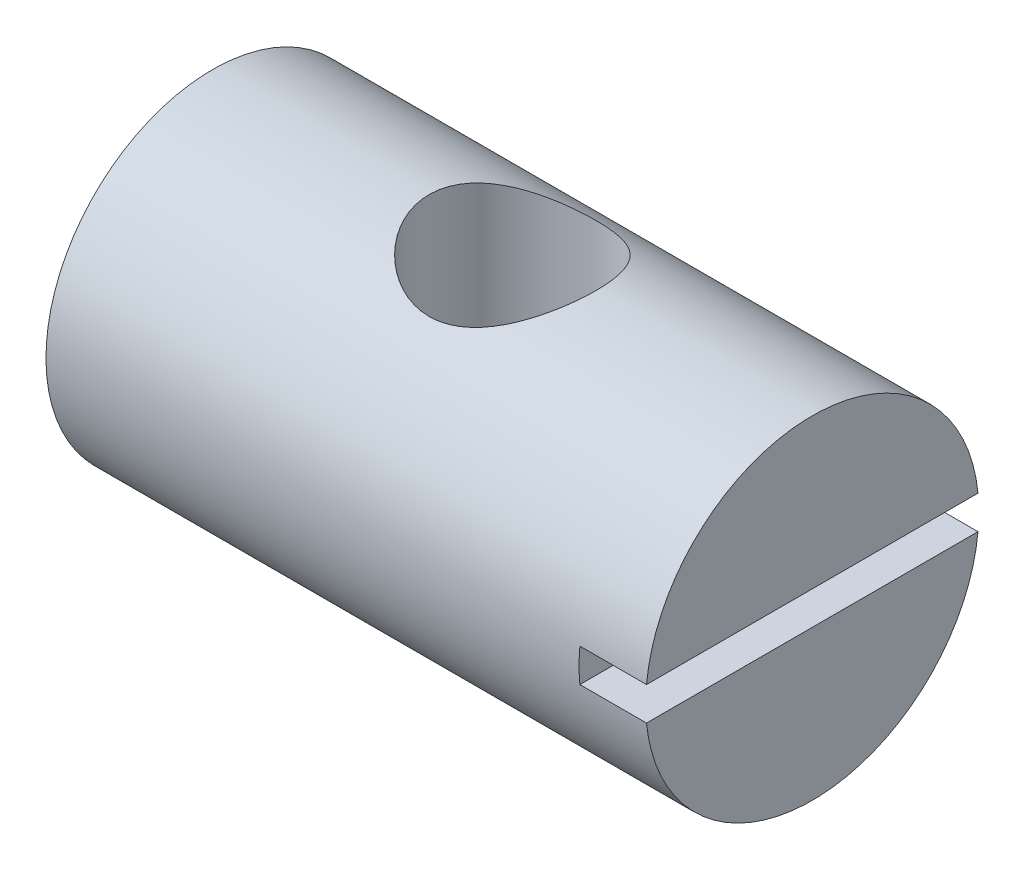
ISO-10303-21;
HEADER;
FILE_DESCRIPTION(('STEP AP214'),'2;1');
FILE_NAME('part.step','',(''),(''),'','','');
FILE_SCHEMA(('AUTOMOTIVE_DESIGN { 1 0 10303 214 1 1 1 1 }'));
ENDSEC;
DATA;
#1=APPLICATION_CONTEXT('core data for automotive mechanical design processes');
#2=APPLICATION_PROTOCOL_DEFINITION('international standard','automotive_design',2000,#1);
#3=PRODUCT_CONTEXT('',#1,'mechanical');
#4=PRODUCT('Part','Part','',(#3));
#5=PRODUCT_RELATED_PRODUCT_CATEGORY('part','',(#4));
#6=PRODUCT_DEFINITION_FORMATION('','',#4);
#7=PRODUCT_DEFINITION_CONTEXT('part definition',#1,'design');
#8=PRODUCT_DEFINITION('design','',#6,#7);
#9=PRODUCT_DEFINITION_SHAPE('','',#8);
#10=(LENGTH_UNIT() NAMED_UNIT(*) SI_UNIT(.MILLI.,.METRE.));
#11=(NAMED_UNIT(*) PLANE_ANGLE_UNIT() SI_UNIT($,.RADIAN.));
#12=(NAMED_UNIT(*) SI_UNIT($,.STERADIAN.) SOLID_ANGLE_UNIT());
#13=UNCERTAINTY_MEASURE_WITH_UNIT(LENGTH_MEASURE(1.E-05),#10,'distance_accuracy_value','');
#14=(GEOMETRIC_REPRESENTATION_CONTEXT(3) GLOBAL_UNCERTAINTY_ASSIGNED_CONTEXT((#13)) GLOBAL_UNIT_ASSIGNED_CONTEXT((#10,
#11,#12)) REPRESENTATION_CONTEXT('',''));
#15=CARTESIAN_POINT('',(0.,0.,0.));
#16=DIRECTION('',(0.,0.,1.));
#17=DIRECTION('',(1.,0.,0.));
#18=AXIS2_PLACEMENT_3D('',#15,#16,#17);
#19=CARTESIAN_POINT('',(9.,0.,0.));
#20=DIRECTION('',(1.,0.,0.));
#21=DIRECTION('',(0.,0.,-1.));
#22=AXIS2_PLACEMENT_3D('',#19,#20,#21);
#23=PLANE('',#22);
#24=DIRECTION('',(0.,0.,-1.));
#25=VECTOR('',#24,1.);
#26=CARTESIAN_POINT('',(9.,-0.5,0.));
#27=LINE('',#26,#25);
#28=CARTESIAN_POINT('',(9.,-0.5,4.9749371855331));
#29=VERTEX_POINT('',#28);
#30=CARTESIAN_POINT('',(9.,-0.5,-4.9749371855331));
#31=VERTEX_POINT('',#30);
#32=EDGE_CURVE('E81',#29,#31,#27,.T.);
#33=ORIENTED_EDGE('',*,*,#32,.F.);
#34=CARTESIAN_POINT('',(9.,0.,0.));
#35=DIRECTION('',(1.,0.,0.));
#36=DIRECTION('',(0.,0.,-1.));
#37=AXIS2_PLACEMENT_3D('',#34,#35,#36);
#38=CIRCLE('',#37,5.);
#39=EDGE_CURVE('E94',#29,#31,#38,.T.);
#40=ORIENTED_EDGE('',*,*,#39,.T.);
#41=EDGE_LOOP('',(#33,#40));
#42=FACE_BOUND('',#41,.T.);
#43=ADVANCED_FACE('F33',(#42),#23,.T.);
#44=CARTESIAN_POINT('',(9.,0.,0.));
#45=DIRECTION('',(-1.,0.,0.));
#46=DIRECTION('',(0.,0.,1.));
#47=AXIS2_PLACEMENT_3D('',#44,#45,#46);
#48=CYLINDRICAL_SURFACE('',#47,5.);
#49=ORIENTED_EDGE('',*,*,#39,.F.);
#50=DIRECTION('',(-1.,0.,0.));
#51=VECTOR('',#50,1.);
#52=CARTESIAN_POINT('',(9.,-0.5,4.9749371855331));
#53=LINE('',#52,#51);
#54=CARTESIAN_POINT('',(7.,-0.5,4.9749371855331));
#55=VERTEX_POINT('',#54);
#56=EDGE_CURVE('E129',#29,#55,#53,.T.);
#57=ORIENTED_EDGE('',*,*,#56,.T.);
#58=CARTESIAN_POINT('',(7.,0.,0.));
#59=DIRECTION('',(1.,0.,0.));
#60=DIRECTION('',(0.,0.,-1.));
#61=AXIS2_PLACEMENT_3D('',#58,#59,#60);
#62=CIRCLE('',#61,5.);
#63=CARTESIAN_POINT('',(7.,0.5,4.9749371855331));
#64=VERTEX_POINT('',#63);
#65=EDGE_CURVE('E11',#64,#55,#62,.T.);
#66=ORIENTED_EDGE('',*,*,#65,.F.);
#67=DIRECTION('',(-1.,0.,0.));
#68=VECTOR('',#67,1.);
#69=CARTESIAN_POINT('',(9.,0.5,4.9749371855331));
#70=LINE('',#69,#68);
#71=CARTESIAN_POINT('',(9.,0.5,4.9749371855331));
#72=VERTEX_POINT('',#71);
#73=EDGE_CURVE('E76',#64,#72,#70,.F.);
#74=ORIENTED_EDGE('',*,*,#73,.T.);
#75=CARTESIAN_POINT('',(9.,0.5,-4.9749371855331));
#76=VERTEX_POINT('',#75);
#77=EDGE_CURVE('E88',#76,#72,#38,.T.);
#78=ORIENTED_EDGE('',*,*,#77,.F.);
#79=DIRECTION('',(-1.,0.,0.));
#80=VECTOR('',#79,1.);
#81=CARTESIAN_POINT('',(9.,0.5,-4.9749371855331));
#82=LINE('',#81,#80);
#83=CARTESIAN_POINT('',(7.,0.5,-4.9749371855331));
#84=VERTEX_POINT('',#83);
#85=EDGE_CURVE('E49',#76,#84,#82,.T.);
#86=ORIENTED_EDGE('',*,*,#85,.T.);
#87=CARTESIAN_POINT('',(7.,-0.5,-4.9749371855331));
#88=VERTEX_POINT('',#87);
#89=EDGE_CURVE('E38',#88,#84,#62,.T.);
#90=ORIENTED_EDGE('',*,*,#89,.F.);
#91=DIRECTION('',(-1.,0.,0.));
#92=VECTOR('',#91,1.);
#93=CARTESIAN_POINT('',(9.,-0.5,-4.9749371855331));
#94=LINE('',#93,#92);
#95=EDGE_CURVE('E57',#88,#31,#94,.F.);
#96=ORIENTED_EDGE('',*,*,#95,.T.);
#97=EDGE_LOOP('',(#49,#57,#66,#74,#78,#86,#90,#96));
#98=FACE_BOUND('',#97,.T.);
#99=CARTESIAN_POINT('',(-2.5,-5.,0.));
#100=CARTESIAN_POINT('',(-2.49999033094399,-4.99999177550472,0.131426682334305));
#101=CARTESIAN_POINT('',(-2.48957443822597,-4.99476199135277,0.263015634437213));
#102=CARTESIAN_POINT('',(-2.44836817883795,-4.9743541856102,0.522301454622883));
#103=CARTESIAN_POINT('',(-2.41753911907498,-4.9591572718767,0.649990448564105));
#104=CARTESIAN_POINT('',(-2.33701537728116,-4.92040690922477,0.897333631316203));
#105=CARTESIAN_POINT('',(-2.28739401221727,-4.89688595907259,1.01701694536277));
#106=CARTESIAN_POINT('',(-2.1710734737482,-4.84364443325827,1.24618160399671));
#107=CARTESIAN_POINT('',(-2.10437564685491,-4.81392434644421,1.3556637520377));
#108=CARTESIAN_POINT('',(-1.95120686835737,-4.74890645050632,1.56876952630998));
#109=CARTESIAN_POINT('',(-1.86378379977022,-4.71337997659091,1.67163802294308));
#110=CARTESIAN_POINT('',(-1.67369630401471,-4.64149925776731,1.86194861703333));
#111=CARTESIAN_POINT('',(-1.57102037115989,-4.60514440566897,1.94937895911555));
#112=CARTESIAN_POINT('',(-1.34379162555472,-4.53247377945622,2.11312999967247));
#113=CARTESIAN_POINT('',(-1.21815975396499,-4.49637967412567,2.18806333849064));
#114=CARTESIAN_POINT('',(-0.954081660204565,-4.43214946943555,2.31542056761491));
#115=CARTESIAN_POINT('',(-0.815644678237381,-4.40400769020792,2.36786053751682));
#116=CARTESIAN_POINT('',(-0.538337236403587,-4.36144667591402,2.44533110537653));
#117=CARTESIAN_POINT('',(-0.399988869820418,-4.34630678958452,2.47181464267578));
#118=CARTESIAN_POINT('',(-0.120052905562392,-4.3295472487215,2.50106748329741));
#119=CARTESIAN_POINT('',(0.0215313521750937,-4.3279142335843,2.50386022093906));
#120=CARTESIAN_POINT('',(0.285715060790882,-4.33777325642937,2.48671821792512));
#121=CARTESIAN_POINT('',(0.408560078058287,-4.34771909154984,2.46946139884055));
#122=CARTESIAN_POINT('',(0.649304773431946,-4.37690571834675,2.41734962264384));
#123=CARTESIAN_POINT('',(0.767202863263112,-4.39614947079454,2.38248905974454));
#124=CARTESIAN_POINT('',(0.998072831414332,-4.44218691031839,2.29552445096459));
#125=CARTESIAN_POINT('',(1.11086599696452,-4.46914601659993,2.24303766778987));
#126=CARTESIAN_POINT('',(1.32658573147497,-4.52758510703513,2.12260421917012));
#127=CARTESIAN_POINT('',(1.42950783900021,-4.55906711950478,2.0546506095312));
#128=CARTESIAN_POINT('',(1.63630313185808,-4.62782894758213,1.89516513728194));
#129=CARTESIAN_POINT('',(1.7386421839404,-4.66533775591865,1.8017361459232));
#130=CARTESIAN_POINT('',(1.92683854647725,-4.73869058251019,1.59888894685344));
#131=CARTESIAN_POINT('',(2.01268798008471,-4.77453379897003,1.48946314143571));
#132=CARTESIAN_POINT('',(2.16921415257432,-4.84254968207409,1.25129126457962));
#133=CARTESIAN_POINT('',(2.23900118111436,-4.87447460405015,1.12188397899853));
#134=CARTESIAN_POINT('',(2.35524257260752,-4.92894702803109,0.851165538721985));
#135=CARTESIAN_POINT('',(2.4017154625379,-4.95150197358893,0.709863940663162));
#136=CARTESIAN_POINT('',(2.4661885092917,-4.98310834353579,0.43191622915178));
#137=CARTESIAN_POINT('',(2.486228089367,-4.9931234575324,0.295853826370905));
#138=CARTESIAN_POINT('',(2.50366182783617,-5.00182533647794,0.021948999873288));
#139=CARTESIAN_POINT('',(2.5010667140985,-5.00051746803426,-0.115892549675109));
#140=CARTESIAN_POINT('',(2.4744832789533,-4.98727980633468,-0.378082429964657));
#141=CARTESIAN_POINT('',(2.45216866817559,-4.97618114219992,-0.502648520123707));
#142=CARTESIAN_POINT('',(2.38940482026162,-4.94555428287529,-0.746017230755972));
#143=CARTESIAN_POINT('',(2.34895358386411,-4.92602515837625,-0.864819214231883));
#144=CARTESIAN_POINT('',(2.25000383391964,-4.87960628532329,-1.09722152111965));
#145=CARTESIAN_POINT('',(2.19102237471768,-4.85252204417873,-1.21057599249831));
#146=CARTESIAN_POINT('',(2.05723116087518,-4.7935993579975,-1.42615340426439));
#147=CARTESIAN_POINT('',(1.98241466348012,-4.76175888940534,-1.52837157450203));
#148=CARTESIAN_POINT('',(1.81059893670911,-4.69270553315087,-1.72941922315487));
#149=CARTESIAN_POINT('',(1.7121428290248,-4.65527212009488,-1.82693019428496));
#150=CARTESIAN_POINT('',(1.50018712195056,-4.58155978921587,-2.0046408025722));
#151=CARTESIAN_POINT('',(1.38667720293013,-4.54528168472407,-2.08482846428685));
#152=CARTESIAN_POINT('',(1.14089086451535,-4.4762798054528,-2.22926978618995));
#153=CARTESIAN_POINT('',(1.00797183470886,-4.44381323981254,-2.29256373922243));
#154=CARTESIAN_POINT('',(0.731224831117449,-4.38935180726746,-2.39520706511459));
#155=CARTESIAN_POINT('',(0.58741118400001,-4.36734345549014,-2.43458729077055));
#156=CARTESIAN_POINT('',(0.307724442637058,-4.33903752569351,-2.48465421767005));
#157=CARTESIAN_POINT('',(0.172414365881031,-4.33143458674096,-2.4977324874436));
#158=CARTESIAN_POINT('',(-0.0986176673806788,-4.32913386592579,-2.50172288950898));
#159=CARTESIAN_POINT('',(-0.234339419873629,-4.33443049025111,-2.49264462983266));
#160=CARTESIAN_POINT('',(-0.48870875561685,-4.35594655164663,-2.45481530197332));
#161=CARTESIAN_POINT('',(-0.607751181720765,-4.37107736338133,-2.42802074302696));
#162=CARTESIAN_POINT('',(-0.839520292199954,-4.40927540337602,-2.35793843840544));
#163=CARTESIAN_POINT('',(-0.952244931566541,-4.43234518434965,-2.31464538728732));
#164=CARTESIAN_POINT('',(-1.17656215271973,-4.48571326433413,-2.20953919315538));
#165=CARTESIAN_POINT('',(-1.28756985173502,-4.5163930799845,-2.14667719009403));
#166=CARTESIAN_POINT('',(-1.49818624324005,-4.58088327077455,-2.0053780838799));
#167=CARTESIAN_POINT('',(-1.59778896262873,-4.61469526970767,-1.92693287765888));
#168=CARTESIAN_POINT('',(-1.79535536374964,-4.68655816327011,-1.74550556946065));
#169=CARTESIAN_POINT('',(-1.89164936417138,-4.7246249151498,-1.6407002246921));
#170=CARTESIAN_POINT('',(-2.06565584942804,-4.79694347383545,-1.41539785420684));
#171=CARTESIAN_POINT('',(-2.14335831860588,-4.83119321905446,-1.29489242426332));
#172=CARTESIAN_POINT('',(-2.2780969794841,-4.89245149457782,-1.03978808878536));
#173=CARTESIAN_POINT('',(-2.33498316778445,-4.91940711437488,-0.905095560782288));
#174=CARTESIAN_POINT('',(-2.4021838587924,-4.95177960923351,-0.696328709257351));
#175=CARTESIAN_POINT('',(-2.42155539800181,-4.96122314081874,-0.625670413494088));
#176=CARTESIAN_POINT('',(-2.4540659483706,-4.97717127275101,-0.482623997839257));
#177=CARTESIAN_POINT('',(-2.46720876667635,-4.98367766823159,-0.410236963092401));
#178=CARTESIAN_POINT('',(-2.48473747228463,-4.9923820076613,-0.281518684621671));
#179=CARTESIAN_POINT('',(-2.49045493653132,-4.99523288466454,-0.225408499555444));
#180=CARTESIAN_POINT('',(-2.49808832946571,-4.99904367329659,-0.112875528456288));
#181=CARTESIAN_POINT('',(-2.50000415322548,-5.00000353273198,-0.0564527338382176));
#182=CARTESIAN_POINT('',(-2.5,-5.,0.));
#183=B_SPLINE_CURVE_WITH_KNOTS('',3,(#99,#100,#101,#102,#103,#104,#105,#106,#107,#108,#109,#110,
#111,#112,#113,#114,#115,#116,#117,#118,#119,#120,#121,#122,#123,#124,#125,#126,#127,#128,#129,
#130,#131,#132,#133,#134,#135,#136,#137,#138,#139,#140,#141,#142,#143,#144,#145,#146,#147,#148,
#149,#150,#151,#152,#153,#154,#155,#156,#157,#158,#159,#160,#161,#162,#163,#164,#165,#166,#167,
#168,#169,#170,#171,#172,#173,#174,#175,#176,#177,#178,#179,#180,#181,#182),.UNSPECIFIED.,.T.,
.F.,(4,2,2,2,2,2,2,2,2,2,2,2,2,2,2,2,2,2,2,2,2,2,2,2,2,2,2,2,2,2,2,2,2,2,2,2,2,2,2,2,2,4),(0.,
0.394060643550731,0.788870374272994,1.18215538873075,1.57540940145392,1.99245439679522,
2.40981559413509,2.85954316076882,3.30894869745702,3.73145030350574,4.15353393322551,
4.52514281023301,4.89687009814196,5.27725600421218,5.65781303150554,6.08662353334696,
6.51563836496716,6.96457555536101,7.41315542280699,7.82458226178364,8.2358141127869,
8.61517266265305,8.99457304077329,9.38482140069746,9.77523626870848,10.2039902661037,
10.6330397153795,11.0828670540368,11.53211279863,11.9382326875699,12.3441764966107,
12.7114482562151,13.0788382197025,13.4709114195009,13.8631890285845,14.303131068923,
14.7433095845248,15.1866003415819,15.407934939208,15.6291340766843,15.7983933645035,
15.9676573239323),.UNSPECIFIED.);
#184=CARTESIAN_POINT('',(-2.5,-5.,0.));
#185=VERTEX_POINT('',#184);
#186=EDGE_CURVE('E82',#185,#185,#183,.T.);
#187=ORIENTED_EDGE('',*,*,#186,.T.);
#188=EDGE_LOOP('',(#187));
#189=FACE_BOUND('',#188,.T.);
#190=CARTESIAN_POINT('',(0.,4.33012701892219,2.5));
#191=CARTESIAN_POINT('',(-0.130266506876492,4.33013982272992,2.49998948436432));
#192=CARTESIAN_POINT('',(-0.260702720676248,4.33609541965583,2.48974954513168));
#193=CARTESIAN_POINT('',(-0.517568971529232,4.35905877051907,2.44930840724943));
#194=CARTESIAN_POINT('',(-0.64399000405729,4.37608974726023,2.41906526369545));
#195=CARTESIAN_POINT('',(-0.888628945561065,4.41873376871659,2.3402497699757));
#196=CARTESIAN_POINT('',(-1.00688657356221,4.44430111338921,2.29177485369963));
#197=CARTESIAN_POINT('',(-1.23356056309455,4.50106659111456,2.17816884056414));
#198=CARTESIAN_POINT('',(-1.34197639179579,4.53226502875883,2.11303684262671));
#199=CARTESIAN_POINT('',(-1.55576430391692,4.59992173524851,1.96166634317253));
#200=CARTESIAN_POINT('',(-1.66014783448977,4.63660159331577,1.87413008816917));
#201=CARTESIAN_POINT('',(-1.8535209757132,4.70929956727453,1.68313452122752));
#202=CARTESIAN_POINT('',(-1.94250290775495,4.74531734512768,1.57966731506051));
#203=CARTESIAN_POINT('',(-2.10841787648564,4.81553692452135,1.35122390789082));
#204=CARTESIAN_POINT('',(-2.18413441927914,4.84945266064072,1.22526797235894));
#205=CARTESIAN_POINT('',(-2.31285213348386,4.90876890230193,0.960392566671146));
#206=CARTESIAN_POINT('',(-2.3658676404385,4.93417477954535,0.821481345389982));
#207=CARTESIAN_POINT('',(-2.44376165316397,4.9720115311507,0.545112359773522));
#208=CARTESIAN_POINT('',(-2.47037381586513,4.98523700553425,0.408254476210982));
#209=CARTESIAN_POINT('',(-2.50041529671129,5.00018959613973,0.131426571755676));
#210=CARTESIAN_POINT('',(-2.50385864199536,5.00192366961168,-0.00854151460650849));
#211=CARTESIAN_POINT('',(-2.48813331506858,4.99407454791405,-0.274581311061964));
#212=CARTESIAN_POINT('',(-2.47090496119546,4.98546239730476,-0.400802997942673));
#213=CARTESIAN_POINT('',(-2.41779789023985,4.95935613149294,-0.64828442979511));
#214=CARTESIAN_POINT('',(-2.38191777755984,4.94186135165964,-0.769543802734626));
#215=CARTESIAN_POINT('',(-2.29229358477506,4.89928958219156,-1.00577347892407));
#216=CARTESIAN_POINT('',(-2.23830921706972,4.87411103823003,-1.120633558788));
#217=CARTESIAN_POINT('',(-2.11434145949638,4.81844114966712,-1.33994200378327));
#218=CARTESIAN_POINT('',(-2.04435234174416,4.78794790393709,-1.4443866220966));
#219=CARTESIAN_POINT('',(-1.88276162116743,4.72110985998075,-1.6504341522455));
#220=CARTESIAN_POINT('',(-1.78974242918497,4.68448439995438,-1.7508351875734));
#221=CARTESIAN_POINT('',(-1.58852568767457,4.61135851467029,-1.93526092574445));
#222=CARTESIAN_POINT('',(-1.48031656931485,4.57485820664072,-2.01927302893557));
#223=CARTESIAN_POINT('',(-1.24337951893978,4.50360390231212,-2.17376333660553));
#224=CARTESIAN_POINT('',(-1.11378494236447,4.46910799976769,-2.24304328744513));
#225=CARTESIAN_POINT('',(-0.842655821602506,4.4093862569644,-2.35829778250308));
#226=CARTESIAN_POINT('',(-0.701133917456094,4.38415075115168,-2.40429664552722));
#227=CARTESIAN_POINT('',(-0.421963721793026,4.34861589542586,-2.4679505275626));
#228=CARTESIAN_POINT('',(-0.284897202391128,4.33729139621241,-2.48756280529994));
#229=CARTESIAN_POINT('',(-0.00899664620863811,4.32794798404024,-2.50379236652857));
#230=CARTESIAN_POINT('',(0.129836072799496,4.32991967223279,-2.50042589328757));
#231=CARTESIAN_POINT('',(0.389134796446796,4.34585841351462,-2.47259010835991));
#232=CARTESIAN_POINT('',(0.50994862776973,4.35848968766635,-2.45046954178116));
#233=CARTESIAN_POINT('',(0.745919465677485,4.39235053878353,-2.38924071158112));
#234=CARTESIAN_POINT('',(0.861074626866852,4.41358290012585,-2.35012694655908));
#235=CARTESIAN_POINT('',(1.08852832725639,4.46340555199141,-2.25411897151217));
#236=CARTESIAN_POINT('',(1.20044754213256,4.49229108107657,-2.19648515923162));
#237=CARTESIAN_POINT('',(1.4136731788488,4.55390298743125,-2.0657176600397));
#238=CARTESIAN_POINT('',(1.51497410878814,4.58663133387872,-1.99257601083123));
#239=CARTESIAN_POINT('',(1.71744691880332,4.65719996140836,-1.82209291799636));
#240=CARTESIAN_POINT('',(1.81699287677222,4.69516457885708,-1.72286318078434));
#241=CARTESIAN_POINT('',(1.99853059500591,4.76835587444746,-1.50851123849879));
#242=CARTESIAN_POINT('',(2.08051642565855,4.80358162519329,-1.39338368664988));
#243=CARTESIAN_POINT('',(2.22643431479089,4.86853404227334,-1.14633840638507));
#244=CARTESIAN_POINT('',(2.28983279520846,4.89809104179855,-1.01405774389062));
#245=CARTESIAN_POINT('',(2.39284475996202,4.9470838739847,-0.738805911647331));
#246=CARTESIAN_POINT('',(2.43247912960512,4.96652859191746,-0.595844253647066));
#247=CARTESIAN_POINT('',(2.48342140935642,4.99168770453968,-0.317449205674705));
#248=CARTESIAN_POINT('',(2.49699468583034,4.99849819767838,-0.182528609085376));
#249=CARTESIAN_POINT('',(2.50210816749459,5.00105325940467,0.0878149643374313));
#250=CARTESIAN_POINT('',(2.49365608566108,4.99680170177042,0.223237748727017));
#251=CARTESIAN_POINT('',(2.45645896960449,4.97834922085637,0.481344982671074));
#252=CARTESIAN_POINT('',(2.42908782836368,4.96482236636807,0.604280801321774));
#253=CARTESIAN_POINT('',(2.35668255024167,4.92980234191731,0.843614873664456));
#254=CARTESIAN_POINT('',(2.31164588036637,4.90830802955518,0.960012187087214));
#255=CARTESIAN_POINT('',(2.20318218126074,4.85814826741488,1.18855854199593));
#256=CARTESIAN_POINT('',(2.13905097531015,4.82921542506803,1.30031295715363));
#257=CARTESIAN_POINT('',(1.99510588985241,4.76720333344986,1.51193650408535));
#258=CARTESIAN_POINT('',(1.91528480737313,4.73412218229104,1.61180014305397));
#259=CARTESIAN_POINT('',(1.73300420555064,4.66321523550925,1.8072854232437));
#260=CARTESIAN_POINT('',(1.62908227399927,4.62524489658366,1.90149582349003));
#261=CARTESIAN_POINT('',(1.40638471461777,4.55157698284941,2.07165660492503));
#262=CARTESIAN_POINT('',(1.28759608580077,4.51588143910584,2.1475908315154));
#263=CARTESIAN_POINT('',(1.03336388233574,4.44998982823926,2.28108393396028));
#264=CARTESIAN_POINT('',(0.897512611575395,4.42000320346984,2.3379862797745));
#265=CARTESIAN_POINT('',(0.686777350480225,4.38370272660093,2.40494911880459));
#266=CARTESIAN_POINT('',(0.615440224302389,4.37305486646054,2.42419582683991));
#267=CARTESIAN_POINT('',(0.470959303150665,4.35507574170935,2.45635087255789));
#268=CARTESIAN_POINT('',(0.397816809045583,4.34774215854234,2.46926364179176));
#269=CARTESIAN_POINT('',(0.27049901345306,4.3382377954292,2.48591166201423));
#270=CARTESIAN_POINT('',(0.216583678487793,4.33520487024791,2.49118864979202));
#271=CARTESIAN_POINT('',(0.108455383689593,4.33114674911323,2.49823512543933));
#272=CARTESIAN_POINT('',(0.0542424041894478,4.33012168747261,2.50000437866474));
#273=CARTESIAN_POINT('',(0.,4.33012701892219,2.5));
#274=B_SPLINE_CURVE_WITH_KNOTS('',3,(#190,#191,#192,#193,#194,#195,#196,#197,#198,#199,#200,
#201,#202,#203,#204,#205,#206,#207,#208,#209,#210,#211,#212,#213,#214,#215,#216,#217,#218,#219,
#220,#221,#222,#223,#224,#225,#226,#227,#228,#229,#230,#231,#232,#233,#234,#235,#236,#237,#238,
#239,#240,#241,#242,#243,#244,#245,#246,#247,#248,#249,#250,#251,#252,#253,#254,#255,#256,#257,
#258,#259,#260,#261,#262,#263,#264,#265,#266,#267,#268,#269,#270,#271,#272,#273),.UNSPECIFIED.,
.T.,.F.,(4,2,2,2,2,2,2,2,2,2,2,2,2,2,2,2,2,2,2,2,2,2,2,2,2,2,2,2,2,2,2,2,2,2,2,2,2,2,2,2,2,4),
(0.,0.390580306486789,0.781982232062012,1.17132148982692,1.56068181366371,1.98215578129642,
2.40383927716011,2.85394730601992,3.30377067414811,3.72158712424921,4.13915059220183,
4.52040243716429,4.90168281298721,5.2882383683295,5.67493248380763,6.0981797864731,
6.52175120619879,6.97222104328704,7.42221935534345,7.83655727140612,8.25060232976016,
8.61935458565147,8.98822631095241,9.37418241020302,9.76033715555201,10.1951685895662,
10.6301466245059,11.076604535375,11.5226694952701,11.927806759788,12.3328021699001,
12.7111106218381,13.0894733378512,13.4840187680376,13.8787457525688,14.3127560463025,
14.7471485711797,15.195268726016,15.4189244153949,15.6424233996907,15.8050484542806,
15.9676843870379),.UNSPECIFIED.);
#275=CARTESIAN_POINT('',(0.,4.33012701892219,2.5));
#276=VERTEX_POINT('',#275);
#277=EDGE_CURVE('E93',#276,#276,#274,.T.);
#278=ORIENTED_EDGE('',*,*,#277,.T.);
#279=EDGE_LOOP('',(#278));
#280=FACE_BOUND('',#279,.T.);
#281=CARTESIAN_POINT('',(-9.,0.,0.));
#282=DIRECTION('',(1.,0.,0.));
#283=DIRECTION('',(0.,0.,-1.));
#284=AXIS2_PLACEMENT_3D('',#281,#282,#283);
#285=CIRCLE('',#284,5.);
#286=CARTESIAN_POINT('',(-9.,0.,-5.));
#287=VERTEX_POINT('',#286);
#288=EDGE_CURVE('E99',#287,#287,#285,.T.);
#289=ORIENTED_EDGE('',*,*,#288,.T.);
#290=EDGE_LOOP('',(#289));
#291=FACE_BOUND('',#290,.T.);
#292=ADVANCED_FACE('F35',(#98,#189,#280,#291),#48,.T.);
#293=DIRECTION('',(0.,0.,1.));
#294=VECTOR('',#293,1.);
#295=CARTESIAN_POINT('',(9.,0.5,0.));
#296=LINE('',#295,#294);
#297=EDGE_CURVE('E73',#76,#72,#296,.T.);
#298=ORIENTED_EDGE('',*,*,#297,.F.);
#299=ORIENTED_EDGE('',*,*,#77,.T.);
#300=EDGE_LOOP('',(#298,#299));
#301=FACE_BOUND('',#300,.T.);
#302=ADVANCED_FACE('F92',(#301),#23,.T.);
#303=CARTESIAN_POINT('',(-9.,0.,0.));
#304=DIRECTION('',(1.,0.,0.));
#305=DIRECTION('',(0.,0.,-1.));
#306=AXIS2_PLACEMENT_3D('',#303,#304,#305);
#307=PLANE('',#306);
#308=ORIENTED_EDGE('',*,*,#288,.F.);
#309=EDGE_LOOP('',(#308));
#310=FACE_BOUND('',#309,.T.);
#311=ADVANCED_FACE('F114',(#310),#307,.F.);
#312=CARTESIAN_POINT('',(0.,-5.,0.));
#313=DIRECTION('',(0.,1.,0.));
#314=DIRECTION('',(0.,0.,1.));
#315=AXIS2_PLACEMENT_3D('',#312,#313,#314);
#316=CYLINDRICAL_SURFACE('',#315,2.5);
#317=ORIENTED_EDGE('',*,*,#277,.F.);
#318=EDGE_LOOP('',(#317));
#319=FACE_BOUND('',#318,.T.);
#320=ORIENTED_EDGE('',*,*,#186,.F.);
#321=EDGE_LOOP('',(#320));
#322=FACE_BOUND('',#321,.T.);
#323=ADVANCED_FACE('F108',(#319,#322),#316,.F.);
#324=CARTESIAN_POINT('',(7.,0.,0.));
#325=DIRECTION('',(1.,0.,0.));
#326=DIRECTION('',(0.,0.,-1.));
#327=AXIS2_PLACEMENT_3D('',#324,#325,#326);
#328=PLANE('',#327);
#329=ORIENTED_EDGE('',*,*,#65,.T.);
#330=DIRECTION('',(0.,0.,-1.));
#331=VECTOR('',#330,1.);
#332=CARTESIAN_POINT('',(7.,-0.5,5.43279358753511));
#333=LINE('',#332,#331);
#334=EDGE_CURVE('E90',#55,#88,#333,.T.);
#335=ORIENTED_EDGE('',*,*,#334,.T.);
#336=ORIENTED_EDGE('',*,*,#89,.T.);
#337=DIRECTION('',(0.,0.,1.));
#338=VECTOR('',#337,1.);
#339=CARTESIAN_POINT('',(7.,0.5,5.43279358753511));
#340=LINE('',#339,#338);
#341=EDGE_CURVE('E135',#84,#64,#340,.T.);
#342=ORIENTED_EDGE('',*,*,#341,.T.);
#343=EDGE_LOOP('',(#329,#335,#336,#342));
#344=FACE_BOUND('',#343,.T.);
#345=ADVANCED_FACE('F113',(#344),#328,.T.);
#346=CARTESIAN_POINT('',(7.,-0.5,5.43279358753511));
#347=DIRECTION('',(0.,-1.,0.));
#348=DIRECTION('',(0.,0.,-1.));
#349=AXIS2_PLACEMENT_3D('',#346,#347,#348);
#350=PLANE('',#349);
#351=ORIENTED_EDGE('',*,*,#32,.T.);
#352=ORIENTED_EDGE('',*,*,#95,.F.);
#353=ORIENTED_EDGE('',*,*,#334,.F.);
#354=ORIENTED_EDGE('',*,*,#56,.F.);
#355=EDGE_LOOP('',(#351,#352,#353,#354));
#356=FACE_BOUND('',#355,.T.);
#357=ADVANCED_FACE('F137',(#356),#350,.F.);
#358=CARTESIAN_POINT('',(7.,0.5,5.43279358753511));
#359=DIRECTION('',(0.,1.,0.));
#360=DIRECTION('',(0.,0.,1.));
#361=AXIS2_PLACEMENT_3D('',#358,#359,#360);
#362=PLANE('',#361);
#363=ORIENTED_EDGE('',*,*,#297,.T.);
#364=ORIENTED_EDGE('',*,*,#73,.F.);
#365=ORIENTED_EDGE('',*,*,#341,.F.);
#366=ORIENTED_EDGE('',*,*,#85,.F.);
#367=EDGE_LOOP('',(#363,#364,#365,#366));
#368=FACE_BOUND('',#367,.T.);
#369=ADVANCED_FACE('F75',(#368),#362,.F.);
#370=CLOSED_SHELL('',(#43,#292,#302,#311,#323,#345,#357,#369));
#371=MANIFOLD_SOLID_BREP('B2',#370);
#372=ADVANCED_BREP_SHAPE_REPRESENTATION('',(#18,#371),#14);
#373=SHAPE_DEFINITION_REPRESENTATION(#9,#372);
ENDSEC;
END-ISO-10303-21;
